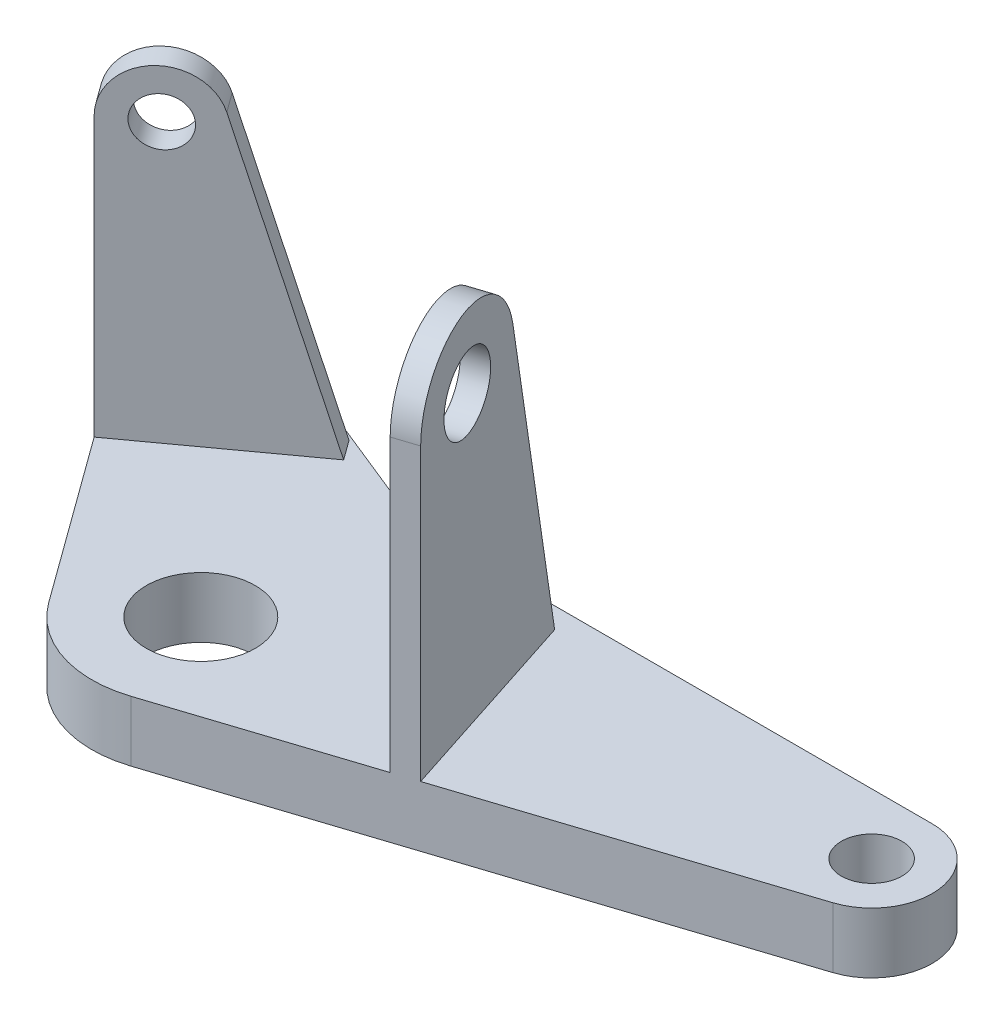
ISO-10303-21;
HEADER;
FILE_DESCRIPTION(('STEP AP214'),'2;1');
FILE_NAME('part.step','',(''),(''),'','','');
FILE_SCHEMA(('AUTOMOTIVE_DESIGN { 1 0 10303 214 1 1 1 1 }'));
ENDSEC;
DATA;
#1=APPLICATION_CONTEXT('core data for automotive mechanical design processes');
#2=APPLICATION_PROTOCOL_DEFINITION('international standard','automotive_design',2000,#1);
#3=PRODUCT_CONTEXT('',#1,'mechanical');
#4=PRODUCT('Part','Part','',(#3));
#5=PRODUCT_RELATED_PRODUCT_CATEGORY('part','',(#4));
#6=PRODUCT_DEFINITION_FORMATION('','',#4);
#7=PRODUCT_DEFINITION_CONTEXT('part definition',#1,'design');
#8=PRODUCT_DEFINITION('design','',#6,#7);
#9=PRODUCT_DEFINITION_SHAPE('','',#8);
#10=(LENGTH_UNIT() NAMED_UNIT(*) SI_UNIT(.MILLI.,.METRE.));
#11=(NAMED_UNIT(*) PLANE_ANGLE_UNIT() SI_UNIT($,.RADIAN.));
#12=(NAMED_UNIT(*) SI_UNIT($,.STERADIAN.) SOLID_ANGLE_UNIT());
#13=UNCERTAINTY_MEASURE_WITH_UNIT(LENGTH_MEASURE(1.E-05),#10,'distance_accuracy_value','');
#14=(GEOMETRIC_REPRESENTATION_CONTEXT(3) GLOBAL_UNCERTAINTY_ASSIGNED_CONTEXT((#13)) GLOBAL_UNIT_ASSIGNED_CONTEXT((#10,
#11,#12)) REPRESENTATION_CONTEXT('',''));
#15=CARTESIAN_POINT('',(0.,0.,0.));
#16=DIRECTION('',(0.,0.,1.));
#17=DIRECTION('',(1.,0.,0.));
#18=AXIS2_PLACEMENT_3D('',#15,#16,#17);
#19=CARTESIAN_POINT('',(-48.,10.,-45.6507127821668));
#20=DIRECTION('',(0.,1.,0.));
#21=DIRECTION('',(0.,0.,1.));
#22=AXIS2_PLACEMENT_3D('',#19,#20,#21);
#23=PLANE('',#22);
#24=DIRECTION('',(-0.809016994374944,8.30017047649198E-13,0.587785252292478));
#25=VECTOR('',#24,1.);
#26=CARTESIAN_POINT('',(-13.0218832017287,9.9999999999755,-37.5096312042176));
#27=LINE('',#26,#25);
#28=CARTESIAN_POINT('',(-13.0218832017374,10.,-37.5096312042176));
#29=VERTEX_POINT('',#28);
#30=CARTESIAN_POINT('',(-36.8981454858631,10.,-20.1625112449833));
#31=VERTEX_POINT('',#30);
#32=EDGE_CURVE('E66',#29,#31,#27,.T.);
#33=ORIENTED_EDGE('',*,*,#32,.F.);
#34=DIRECTION('',(0.587785252292478,0.,0.809016994374944));
#35=VECTOR('',#34,1.);
#36=CARTESIAN_POINT('',(-13.0218832017287,9.9999999999755,-37.5096312042176));
#37=LINE('',#36,#35);
#38=CARTESIAN_POINT('',(-10.6707421925645,10.,-34.2735632267137));
#39=VERTEX_POINT('',#38);
#40=EDGE_CURVE('E61',#29,#39,#37,.T.);
#41=ORIENTED_EDGE('',*,*,#40,.T.);
#42=DIRECTION('',(-0.809016994374944,8.30017047649198E-13,0.587785252292478));
#43=VECTOR('',#42,1.);
#44=CARTESIAN_POINT('',(-10.6707421925588,9.9999999999755,-34.2735632267178));
#45=LINE('',#44,#43);
#46=CARTESIAN_POINT('',(-34.5470044766932,10.,-16.9264432674835));
#47=VERTEX_POINT('',#46);
#48=EDGE_CURVE('E189',#39,#47,#45,.T.);
#49=ORIENTED_EDGE('',*,*,#48,.T.);
#50=DIRECTION('',(0.587785252292477,0.,0.809016994374944));
#51=VECTOR('',#50,1.);
#52=CARTESIAN_POINT('',(-52.8541019662497,10.,-42.1240012684119));
#53=LINE('',#52,#51);
#54=CARTESIAN_POINT('',(-14.562305898749,10.,10.5801345412646));
#55=VERTEX_POINT('',#54);
#56=EDGE_CURVE('E282',#47,#55,#53,.T.);
#57=ORIENTED_EDGE('',*,*,#56,.T.);
#58=CARTESIAN_POINT('',(0.,10.,0.));
#59=DIRECTION('',(0.,1.,0.));
#60=DIRECTION('',(0.,0.,-1.));
#61=AXIS2_PLACEMENT_3D('',#58,#59,#60);
#62=CIRCLE('',#61,18.);
#63=CARTESIAN_POINT('',(5.56230589874895,10.,17.1190172933128));
#64=VERTEX_POINT('',#63);
#65=EDGE_CURVE('E287',#55,#64,#62,.T.);
#66=ORIENTED_EDGE('',*,*,#65,.T.);
#67=DIRECTION('',(0.951056516295155,0.,-0.309016994374942));
#68=VECTOR('',#67,1.);
#69=CARTESIAN_POINT('',(5.56230589874895,10.,17.1190172933128));
#70=LINE('',#69,#68);
#71=CARTESIAN_POINT('',(37.8982274527843,10.,6.61243948456478));
#72=VERTEX_POINT('',#71);
#73=EDGE_CURVE('E291',#64,#72,#70,.T.);
#74=ORIENTED_EDGE('',*,*,#73,.T.);
#75=DIRECTION('',(0.309016994374942,0.,0.951056516295156));
#76=VECTOR('',#75,1.);
#77=CARTESIAN_POINT('',(27.2461637945997,10.,-26.1712414731734));
#78=LINE('',#77,#76);
#79=CARTESIAN_POINT('',(27.2461637945997,10.,-26.1712414731734));
#80=VERTEX_POINT('',#79);
#81=EDGE_CURVE('E209',#80,#72,#78,.T.);
#82=ORIENTED_EDGE('',*,*,#81,.F.);
#83=DIRECTION('',(-0.951056516295155,0.,0.309016994374942));
#84=VECTOR('',#83,1.);
#85=CARTESIAN_POINT('',(31.0503898597803,10.,-27.4073094506732));
#86=LINE('',#85,#84);
#87=CARTESIAN_POINT('',(31.0503898597803,10.,-27.4073094506732));
#88=VERTEX_POINT('',#87);
#89=EDGE_CURVE('E245',#88,#80,#86,.T.);
#90=ORIENTED_EDGE('',*,*,#89,.F.);
#91=DIRECTION('',(0.309016994374942,0.,0.951056516295156));
#92=VECTOR('',#91,1.);
#93=CARTESIAN_POINT('',(31.0503898597803,10.,-27.4073094506732));
#94=LINE('',#93,#92);
#95=CARTESIAN_POINT('',(41.7024535179649,10.,5.37637150706501));
#96=VERTEX_POINT('',#95);
#97=EDGE_CURVE('E213',#88,#96,#94,.T.);
#98=ORIENTED_EDGE('',*,*,#97,.T.);
#99=CARTESIAN_POINT('',(93.0901699437494,10.,-11.3205097041033));
#100=VERTEX_POINT('',#99);
#101=EDGE_CURVE('E290',#96,#100,#70,.T.);
#102=ORIENTED_EDGE('',*,*,#101,.T.);
#103=CARTESIAN_POINT('',(90.,10.,-20.8310748670548));
#104=DIRECTION('',(0.,1.,0.));
#105=DIRECTION('',(0.,0.,1.));
#106=AXIS2_PLACEMENT_3D('',#103,#104,#105);
#107=CIRCLE('',#106,10.);
#108=CARTESIAN_POINT('',(90.,10.,-30.8310748670549));
#109=VERTEX_POINT('',#108);
#110=EDGE_CURVE('E295',#100,#109,#107,.T.);
#111=ORIENTED_EDGE('',*,*,#110,.T.);
#112=DIRECTION('',(-1.,0.,0.));
#113=VECTOR('',#112,1.);
#114=CARTESIAN_POINT('',(90.,10.,-30.8310748670549));
#115=LINE('',#114,#113);
#116=CARTESIAN_POINT('',(12.8606669351914,10.,-30.8310748670548));
#117=VERTEX_POINT('',#116);
#118=EDGE_CURVE('E298',#109,#117,#115,.T.);
#119=ORIENTED_EDGE('',*,*,#118,.T.);
#120=CARTESIAN_POINT('',(12.8606669351914,10.,-72.8310748670548));
#121=DIRECTION('',(0.,-1.,0.));
#122=DIRECTION('',(0.,0.,-1.));
#123=AXIS2_PLACEMENT_3D('',#120,#121,#122);
#124=CIRCLE('',#123,42.);
#125=CARTESIAN_POINT('',(-2.87280998827696,10.,-33.8893529752498));
#126=VERTEX_POINT('',#125);
#127=EDGE_CURVE('E301',#117,#126,#124,.T.);
#128=ORIENTED_EDGE('',*,*,#127,.T.);
#129=DIRECTION('',(-0.927183854566787,0.,-0.374606593415913));
#130=VECTOR('',#129,1.);
#131=CARTESIAN_POINT('',(-2.87280998827696,10.,-33.8893529752498));
#132=LINE('',#131,#130);
#133=CARTESIAN_POINT('',(-45.7523604395045,10.,-51.2138159095675));
#134=VERTEX_POINT('',#133);
#135=EDGE_CURVE('E304',#126,#134,#132,.T.);
#136=ORIENTED_EDGE('',*,*,#135,.T.);
#137=CARTESIAN_POINT('',(-48.,10.,-45.6507127821668));
#138=DIRECTION('',(0.,1.,0.));
#139=DIRECTION('',(0.,0.,1.));
#140=AXIS2_PLACEMENT_3D('',#137,#138,#139);
#141=CIRCLE('',#140,5.99999999999999);
#142=CARTESIAN_POINT('',(-52.8541019662497,10.,-42.1240012684119));
#143=VERTEX_POINT('',#142);
#144=EDGE_CURVE('E278',#134,#143,#141,.T.);
#145=ORIENTED_EDGE('',*,*,#144,.T.);
#146=EDGE_CURVE('E284',#143,#31,#53,.T.);
#147=ORIENTED_EDGE('',*,*,#146,.T.);
#148=EDGE_LOOP('',(#33,#41,#49,#57,#66,#74,#82,#90,#98,#102,#111,#119,#128,#136,#145,#147));
#149=FACE_BOUND('',#148,.T.);
#150=CARTESIAN_POINT('',(90.,10.,-20.8310748670548));
#151=DIRECTION('',(0.,1.,0.));
#152=DIRECTION('',(0.,0.,1.));
#153=AXIS2_PLACEMENT_3D('',#150,#151,#152);
#154=CIRCLE('',#153,5.);
#155=CARTESIAN_POINT('',(90.,10.,-15.8310748670548));
#156=VERTEX_POINT('',#155);
#157=EDGE_CURVE('E262',#156,#156,#154,.T.);
#158=ORIENTED_EDGE('',*,*,#157,.F.);
#159=EDGE_LOOP('',(#158));
#160=FACE_BOUND('',#159,.T.);
#161=CARTESIAN_POINT('',(0.,10.,0.));
#162=DIRECTION('',(0.,1.,0.));
#163=DIRECTION('',(0.,0.,1.));
#164=AXIS2_PLACEMENT_3D('',#161,#162,#163);
#165=CIRCLE('',#164,9.);
#166=CARTESIAN_POINT('',(0.,10.,9.));
#167=VERTEX_POINT('',#166);
#168=EDGE_CURVE('E270',#167,#167,#165,.T.);
#169=ORIENTED_EDGE('',*,*,#168,.F.);
#170=EDGE_LOOP('',(#169));
#171=FACE_BOUND('',#170,.T.);
#172=CARTESIAN_POINT('',(-48.,10.,-45.6507127821668));
#173=DIRECTION('',(0.,1.,0.));
#174=DIRECTION('',(0.,0.,1.));
#175=AXIS2_PLACEMENT_3D('',#172,#173,#174);
#176=CIRCLE('',#175,3.);
#177=CARTESIAN_POINT('',(-48.,10.,-42.6507127821668));
#178=VERTEX_POINT('',#177);
#179=EDGE_CURVE('E254',#178,#178,#176,.T.);
#180=ORIENTED_EDGE('',*,*,#179,.F.);
#181=EDGE_LOOP('',(#180));
#182=FACE_BOUND('',#181,.T.);
#183=ADVANCED_FACE('F45',(#149,#160,#171,#182),#23,.T.);
#184=CARTESIAN_POINT('',(-48.,0.,-45.6507127821668));
#185=DIRECTION('',(0.,1.,0.));
#186=DIRECTION('',(0.,0.,1.));
#187=AXIS2_PLACEMENT_3D('',#184,#185,#186);
#188=PLANE('',#187);
#189=CARTESIAN_POINT('',(-48.,0.,-45.6507127821668));
#190=DIRECTION('',(0.,1.,0.));
#191=DIRECTION('',(0.,0.,1.));
#192=AXIS2_PLACEMENT_3D('',#189,#190,#191);
#193=CIRCLE('',#192,5.99999999999999);
#194=CARTESIAN_POINT('',(-45.7523604395045,0.,-51.2138159095675));
#195=VERTEX_POINT('',#194);
#196=CARTESIAN_POINT('',(-52.8541019662497,0.,-42.1240012684119));
#197=VERTEX_POINT('',#196);
#198=EDGE_CURVE('E274',#195,#197,#193,.T.);
#199=ORIENTED_EDGE('',*,*,#198,.F.);
#200=DIRECTION('',(-0.927183854566787,0.,-0.374606593415913));
#201=VECTOR('',#200,1.);
#202=CARTESIAN_POINT('',(-2.87280998827696,0.,-33.8893529752498));
#203=LINE('',#202,#201);
#204=CARTESIAN_POINT('',(-2.87280998827696,0.,-33.8893529752498));
#205=VERTEX_POINT('',#204);
#206=EDGE_CURVE('E283',#205,#195,#203,.T.);
#207=ORIENTED_EDGE('',*,*,#206,.F.);
#208=CARTESIAN_POINT('',(12.8606669351914,0.,-72.8310748670548));
#209=DIRECTION('',(0.,-1.,0.));
#210=DIRECTION('',(0.,0.,-1.));
#211=AXIS2_PLACEMENT_3D('',#208,#209,#210);
#212=CIRCLE('',#211,42.);
#213=CARTESIAN_POINT('',(12.8606669351914,0.,-30.8310748670548));
#214=VERTEX_POINT('',#213);
#215=EDGE_CURVE('E326',#214,#205,#212,.T.);
#216=ORIENTED_EDGE('',*,*,#215,.F.);
#217=DIRECTION('',(-1.,0.,0.));
#218=VECTOR('',#217,1.);
#219=CARTESIAN_POINT('',(90.,0.,-30.8310748670549));
#220=LINE('',#219,#218);
#221=CARTESIAN_POINT('',(90.,0.,-30.8310748670549));
#222=VERTEX_POINT('',#221);
#223=EDGE_CURVE('E323',#222,#214,#220,.T.);
#224=ORIENTED_EDGE('',*,*,#223,.F.);
#225=CARTESIAN_POINT('',(90.,0.,-20.8310748670548));
#226=DIRECTION('',(0.,1.,0.));
#227=DIRECTION('',(0.,0.,1.));
#228=AXIS2_PLACEMENT_3D('',#225,#226,#227);
#229=CIRCLE('',#228,10.);
#230=CARTESIAN_POINT('',(93.0901699437494,0.,-11.3205097041033));
#231=VERTEX_POINT('',#230);
#232=EDGE_CURVE('E320',#231,#222,#229,.T.);
#233=ORIENTED_EDGE('',*,*,#232,.F.);
#234=DIRECTION('',(0.951056516295155,0.,-0.309016994374942));
#235=VECTOR('',#234,1.);
#236=CARTESIAN_POINT('',(5.56230589874895,0.,17.1190172933128));
#237=LINE('',#236,#235);
#238=CARTESIAN_POINT('',(5.56230589874895,0.,17.1190172933128));
#239=VERTEX_POINT('',#238);
#240=EDGE_CURVE('E317',#239,#231,#237,.T.);
#241=ORIENTED_EDGE('',*,*,#240,.F.);
#242=CARTESIAN_POINT('',(0.,0.,0.));
#243=DIRECTION('',(0.,1.,0.));
#244=DIRECTION('',(0.,0.,-1.));
#245=AXIS2_PLACEMENT_3D('',#242,#243,#244);
#246=CIRCLE('',#245,18.);
#247=CARTESIAN_POINT('',(-14.562305898749,0.,10.5801345412646));
#248=VERTEX_POINT('',#247);
#249=EDGE_CURVE('E314',#248,#239,#246,.T.);
#250=ORIENTED_EDGE('',*,*,#249,.F.);
#251=DIRECTION('',(0.587785252292477,0.,0.809016994374944));
#252=VECTOR('',#251,1.);
#253=CARTESIAN_POINT('',(-52.8541019662497,0.,-42.1240012684119));
#254=LINE('',#253,#252);
#255=EDGE_CURVE('E311',#197,#248,#254,.T.);
#256=ORIENTED_EDGE('',*,*,#255,.F.);
#257=EDGE_LOOP('',(#199,#207,#216,#224,#233,#241,#250,#256));
#258=FACE_BOUND('',#257,.T.);
#259=CARTESIAN_POINT('',(0.,0.,0.));
#260=DIRECTION('',(0.,1.,0.));
#261=DIRECTION('',(0.,0.,1.));
#262=AXIS2_PLACEMENT_3D('',#259,#260,#261);
#263=CIRCLE('',#262,9.);
#264=CARTESIAN_POINT('',(0.,0.,9.));
#265=VERTEX_POINT('',#264);
#266=EDGE_CURVE('E266',#265,#265,#263,.T.);
#267=ORIENTED_EDGE('',*,*,#266,.T.);
#268=EDGE_LOOP('',(#267));
#269=FACE_BOUND('',#268,.T.);
#270=CARTESIAN_POINT('',(90.,0.,-20.8310748670548));
#271=DIRECTION('',(0.,1.,0.));
#272=DIRECTION('',(0.,0.,1.));
#273=AXIS2_PLACEMENT_3D('',#270,#271,#272);
#274=CIRCLE('',#273,5.);
#275=CARTESIAN_POINT('',(90.,0.,-15.8310748670548));
#276=VERTEX_POINT('',#275);
#277=EDGE_CURVE('E258',#276,#276,#274,.T.);
#278=ORIENTED_EDGE('',*,*,#277,.T.);
#279=EDGE_LOOP('',(#278));
#280=FACE_BOUND('',#279,.T.);
#281=CARTESIAN_POINT('',(-48.,0.,-45.6507127821668));
#282=DIRECTION('',(0.,1.,0.));
#283=DIRECTION('',(0.,0.,1.));
#284=AXIS2_PLACEMENT_3D('',#281,#282,#283);
#285=CIRCLE('',#284,3.);
#286=CARTESIAN_POINT('',(-48.,0.,-42.6507127821668));
#287=VERTEX_POINT('',#286);
#288=EDGE_CURVE('E248',#287,#287,#285,.T.);
#289=ORIENTED_EDGE('',*,*,#288,.T.);
#290=EDGE_LOOP('',(#289));
#291=FACE_BOUND('',#290,.T.);
#292=ADVANCED_FACE('F364',(#258,#269,#280,#291),#188,.F.);
#293=CARTESIAN_POINT('',(-48.,10.,-45.6507127821668));
#294=DIRECTION('',(0.,-1.,0.));
#295=DIRECTION('',(0.,0.,-1.));
#296=AXIS2_PLACEMENT_3D('',#293,#294,#295);
#297=CYLINDRICAL_SURFACE('',#296,5.99999999999999);
#298=ORIENTED_EDGE('',*,*,#198,.T.);
#299=DIRECTION('',(0.,-1.,0.));
#300=VECTOR('',#299,1.);
#301=CARTESIAN_POINT('',(-52.8541019662497,10.,-42.1240012684119));
#302=LINE('',#301,#300);
#303=EDGE_CURVE('E11',#143,#197,#302,.T.);
#304=ORIENTED_EDGE('',*,*,#303,.F.);
#305=ORIENTED_EDGE('',*,*,#144,.F.);
#306=DIRECTION('',(0.,-1.,0.));
#307=VECTOR('',#306,1.);
#308=CARTESIAN_POINT('',(-45.7523604395045,10.,-51.2138159095675));
#309=LINE('',#308,#307);
#310=EDGE_CURVE('E307',#134,#195,#309,.T.);
#311=ORIENTED_EDGE('',*,*,#310,.T.);
#312=EDGE_LOOP('',(#298,#304,#305,#311));
#313=FACE_BOUND('',#312,.T.);
#314=ADVANCED_FACE('F47',(#313),#297,.T.);
#315=CARTESIAN_POINT('',(-52.8541019662497,10.,-42.1240012684119));
#316=DIRECTION('',(0.809016994374944,0.,-0.587785252292478));
#317=DIRECTION('',(-0.587785252292478,0.,-0.809016994374944));
#318=AXIS2_PLACEMENT_3D('',#315,#316,#317);
#319=PLANE('',#318);
#320=ORIENTED_EDGE('',*,*,#255,.T.);
#321=DIRECTION('',(0.,-1.,0.));
#322=VECTOR('',#321,1.);
#323=CARTESIAN_POINT('',(-14.562305898749,10.,10.5801345412646));
#324=LINE('',#323,#322);
#325=EDGE_CURVE('E54',#55,#248,#324,.T.);
#326=ORIENTED_EDGE('',*,*,#325,.F.);
#327=ORIENTED_EDGE('',*,*,#56,.F.);
#328=DIRECTION('',(0.,1.,0.));
#329=VECTOR('',#328,1.);
#330=CARTESIAN_POINT('',(-34.5470044766932,10.,-16.9264432674835));
#331=LINE('',#330,#329);
#332=CARTESIAN_POINT('',(-34.5470044766932,56.,-16.9264432674835));
#333=VERTEX_POINT('',#332);
#334=EDGE_CURVE('E172',#47,#333,#331,.T.);
#335=ORIENTED_EDGE('',*,*,#334,.T.);
#336=DIRECTION('',(0.587785252292478,0.,0.809016994374944));
#337=VECTOR('',#336,1.);
#338=CARTESIAN_POINT('',(-36.8981454858631,56.,-20.1625112449833));
#339=LINE('',#338,#337);
#340=CARTESIAN_POINT('',(-36.8981454858631,56.,-20.1625112449833));
#341=VERTEX_POINT('',#340);
#342=EDGE_CURVE('E169',#341,#333,#339,.T.);
#343=ORIENTED_EDGE('',*,*,#342,.F.);
#344=DIRECTION('',(0.,1.,0.));
#345=VECTOR('',#344,1.);
#346=CARTESIAN_POINT('',(-36.8981454858631,10.,-20.1625112449833));
#347=LINE('',#346,#345);
#348=EDGE_CURVE('E158',#31,#341,#347,.T.);
#349=ORIENTED_EDGE('',*,*,#348,.F.);
#350=ORIENTED_EDGE('',*,*,#146,.F.);
#351=ORIENTED_EDGE('',*,*,#303,.T.);
#352=EDGE_LOOP('',(#320,#326,#327,#335,#343,#349,#350,#351));
#353=FACE_BOUND('',#352,.T.);
#354=ADVANCED_FACE('F170',(#353),#319,.F.);
#355=CARTESIAN_POINT('',(0.,10.,0.));
#356=DIRECTION('',(0.,-1.,0.));
#357=DIRECTION('',(0.,0.,-1.));
#358=AXIS2_PLACEMENT_3D('',#355,#356,#357);
#359=CYLINDRICAL_SURFACE('',#358,18.);
#360=ORIENTED_EDGE('',*,*,#249,.T.);
#361=DIRECTION('',(0.,-1.,0.));
#362=VECTOR('',#361,1.);
#363=CARTESIAN_POINT('',(5.56230589874895,10.,17.1190172933128));
#364=LINE('',#363,#362);
#365=EDGE_CURVE('E350',#64,#239,#364,.T.);
#366=ORIENTED_EDGE('',*,*,#365,.F.);
#367=ORIENTED_EDGE('',*,*,#65,.F.);
#368=ORIENTED_EDGE('',*,*,#325,.T.);
#369=EDGE_LOOP('',(#360,#366,#367,#368));
#370=FACE_BOUND('',#369,.T.);
#371=ADVANCED_FACE('F359',(#370),#359,.T.);
#372=CARTESIAN_POINT('',(5.56230589874895,10.,17.1190172933128));
#373=DIRECTION('',(-0.309016994374942,0.,-0.951056516295156));
#374=DIRECTION('',(-0.951056516295156,0.,0.309016994374942));
#375=AXIS2_PLACEMENT_3D('',#372,#373,#374);
#376=PLANE('',#375);
#377=ORIENTED_EDGE('',*,*,#240,.T.);
#378=DIRECTION('',(0.,-1.,0.));
#379=VECTOR('',#378,1.);
#380=CARTESIAN_POINT('',(93.0901699437494,10.,-11.3205097041033));
#381=LINE('',#380,#379);
#382=EDGE_CURVE('E346',#100,#231,#381,.T.);
#383=ORIENTED_EDGE('',*,*,#382,.F.);
#384=ORIENTED_EDGE('',*,*,#101,.F.);
#385=DIRECTION('',(0.,1.,0.));
#386=VECTOR('',#385,1.);
#387=CARTESIAN_POINT('',(41.7024535179649,10.,5.37637150706501));
#388=LINE('',#387,#386);
#389=CARTESIAN_POINT('',(41.7024535179649,58.,5.376371507065));
#390=VERTEX_POINT('',#389);
#391=EDGE_CURVE('E217',#96,#390,#388,.T.);
#392=ORIENTED_EDGE('',*,*,#391,.T.);
#393=DIRECTION('',(-0.951056516295155,0.,0.309016994374942));
#394=VECTOR('',#393,1.);
#395=CARTESIAN_POINT('',(41.7024535179649,58.,5.376371507065));
#396=LINE('',#395,#394);
#397=CARTESIAN_POINT('',(37.8982274527842,58.,6.61243948456477));
#398=VERTEX_POINT('',#397);
#399=EDGE_CURVE('E230',#390,#398,#396,.T.);
#400=ORIENTED_EDGE('',*,*,#399,.T.);
#401=DIRECTION('',(0.,1.,0.));
#402=VECTOR('',#401,1.);
#403=CARTESIAN_POINT('',(37.8982274527843,10.,6.61243948456478));
#404=LINE('',#403,#402);
#405=EDGE_CURVE('E234',#72,#398,#404,.T.);
#406=ORIENTED_EDGE('',*,*,#405,.F.);
#407=ORIENTED_EDGE('',*,*,#73,.F.);
#408=ORIENTED_EDGE('',*,*,#365,.T.);
#409=EDGE_LOOP('',(#377,#383,#384,#392,#400,#406,#407,#408));
#410=FACE_BOUND('',#409,.T.);
#411=ADVANCED_FACE('F370',(#410),#376,.F.);
#412=CARTESIAN_POINT('',(90.,10.,-20.8310748670548));
#413=DIRECTION('',(0.,-1.,0.));
#414=DIRECTION('',(0.,0.,-1.));
#415=AXIS2_PLACEMENT_3D('',#412,#413,#414);
#416=CYLINDRICAL_SURFACE('',#415,10.);
#417=ORIENTED_EDGE('',*,*,#232,.T.);
#418=DIRECTION('',(0.,-1.,0.));
#419=VECTOR('',#418,1.);
#420=CARTESIAN_POINT('',(90.,10.,-30.8310748670549));
#421=LINE('',#420,#419);
#422=EDGE_CURVE('E342',#109,#222,#421,.T.);
#423=ORIENTED_EDGE('',*,*,#422,.F.);
#424=ORIENTED_EDGE('',*,*,#110,.F.);
#425=ORIENTED_EDGE('',*,*,#382,.T.);
#426=EDGE_LOOP('',(#417,#423,#424,#425));
#427=FACE_BOUND('',#426,.T.);
#428=ADVANCED_FACE('F375',(#427),#416,.T.);
#429=CARTESIAN_POINT('',(90.,10.,-30.8310748670549));
#430=DIRECTION('',(0.,0.,1.));
#431=DIRECTION('',(1.,0.,0.));
#432=AXIS2_PLACEMENT_3D('',#429,#430,#431);
#433=PLANE('',#432);
#434=ORIENTED_EDGE('',*,*,#223,.T.);
#435=DIRECTION('',(0.,-1.,0.));
#436=VECTOR('',#435,1.);
#437=CARTESIAN_POINT('',(12.8606669351914,10.,-30.8310748670548));
#438=LINE('',#437,#436);
#439=EDGE_CURVE('E338',#117,#214,#438,.T.);
#440=ORIENTED_EDGE('',*,*,#439,.F.);
#441=ORIENTED_EDGE('',*,*,#118,.F.);
#442=ORIENTED_EDGE('',*,*,#422,.T.);
#443=EDGE_LOOP('',(#434,#440,#441,#442));
#444=FACE_BOUND('',#443,.T.);
#445=ADVANCED_FACE('F420',(#444),#433,.F.);
#446=CARTESIAN_POINT('',(12.8606669351914,10.,-72.8310748670548));
#447=DIRECTION('',(0.,-1.,0.));
#448=DIRECTION('',(0.,0.,-1.));
#449=AXIS2_PLACEMENT_3D('',#446,#447,#448);
#450=CYLINDRICAL_SURFACE('',#449,42.);
#451=ORIENTED_EDGE('',*,*,#215,.T.);
#452=DIRECTION('',(0.,-1.,0.));
#453=VECTOR('',#452,1.);
#454=CARTESIAN_POINT('',(-2.87280998827696,10.,-33.8893529752498));
#455=LINE('',#454,#453);
#456=EDGE_CURVE('E334',#126,#205,#455,.T.);
#457=ORIENTED_EDGE('',*,*,#456,.F.);
#458=ORIENTED_EDGE('',*,*,#127,.F.);
#459=ORIENTED_EDGE('',*,*,#439,.T.);
#460=EDGE_LOOP('',(#451,#457,#458,#459));
#461=FACE_BOUND('',#460,.T.);
#462=ADVANCED_FACE('F416',(#461),#450,.F.);
#463=CARTESIAN_POINT('',(-2.87280998827696,10.,-33.8893529752498));
#464=DIRECTION('',(-0.374606593415913,0.,0.927183854566787));
#465=DIRECTION('',(0.927183854566787,0.,0.374606593415913));
#466=AXIS2_PLACEMENT_3D('',#463,#464,#465);
#467=PLANE('',#466);
#468=ORIENTED_EDGE('',*,*,#206,.T.);
#469=ORIENTED_EDGE('',*,*,#310,.F.);
#470=ORIENTED_EDGE('',*,*,#135,.F.);
#471=ORIENTED_EDGE('',*,*,#456,.T.);
#472=EDGE_LOOP('',(#468,#469,#470,#471));
#473=FACE_BOUND('',#472,.T.);
#474=ADVANCED_FACE('F413',(#473),#467,.F.);
#475=CARTESIAN_POINT('',(0.,10.,0.));
#476=DIRECTION('',(0.,-1.,0.));
#477=DIRECTION('',(0.,0.,-1.));
#478=AXIS2_PLACEMENT_3D('',#475,#476,#477);
#479=CYLINDRICAL_SURFACE('',#478,9.);
#480=ORIENTED_EDGE('',*,*,#168,.T.);
#481=EDGE_LOOP('',(#480));
#482=FACE_BOUND('',#481,.T.);
#483=ORIENTED_EDGE('',*,*,#266,.F.);
#484=EDGE_LOOP('',(#483));
#485=FACE_BOUND('',#484,.T.);
#486=ADVANCED_FACE('F410',(#482,#485),#479,.F.);
#487=CARTESIAN_POINT('',(90.,10.,-20.8310748670548));
#488=DIRECTION('',(0.,-1.,0.));
#489=DIRECTION('',(0.,0.,-1.));
#490=AXIS2_PLACEMENT_3D('',#487,#488,#489);
#491=CYLINDRICAL_SURFACE('',#490,5.);
#492=ORIENTED_EDGE('',*,*,#157,.T.);
#493=EDGE_LOOP('',(#492));
#494=FACE_BOUND('',#493,.T.);
#495=ORIENTED_EDGE('',*,*,#277,.F.);
#496=EDGE_LOOP('',(#495));
#497=FACE_BOUND('',#496,.T.);
#498=ADVANCED_FACE('F481',(#494,#497),#491,.F.);
#499=CARTESIAN_POINT('',(-48.,10.,-45.6507127821668));
#500=DIRECTION('',(0.,-1.,0.));
#501=DIRECTION('',(0.,0.,-1.));
#502=AXIS2_PLACEMENT_3D('',#499,#500,#501);
#503=CYLINDRICAL_SURFACE('',#502,3.);
#504=ORIENTED_EDGE('',*,*,#179,.T.);
#505=EDGE_LOOP('',(#504));
#506=FACE_BOUND('',#505,.T.);
#507=ORIENTED_EDGE('',*,*,#288,.F.);
#508=EDGE_LOOP('',(#507));
#509=FACE_BOUND('',#508,.T.);
#510=ADVANCED_FACE('F489',(#506,#509),#503,.F.);
#511=CARTESIAN_POINT('',(34.3670788058597,60.494940289813,-17.1995904833932));
#512=DIRECTION('',(-0.302264231633822,0.207911690817752,-0.930273649576359));
#513=DIRECTION('',(-0.951056516295155,0.,0.309016994374942));
#514=AXIS2_PLACEMENT_3D('',#511,#512,#513);
#515=PLANE('',#514);
#516=DIRECTION('',(-0.064248245791914,-0.978147600733807,-0.197735768366167));
#517=VECTOR('',#516,1.);
#518=CARTESIAN_POINT('',(30.5628527406791,60.494940289813,-15.9635225058934));
#519=LINE('',#518,#517);
#520=CARTESIAN_POINT('',(30.5628527406791,60.494940289813,-15.9635225058934));
#521=VERTEX_POINT('',#520);
#522=EDGE_CURVE('E218',#521,#80,#519,.T.);
#523=ORIENTED_EDGE('',*,*,#522,.F.);
#524=DIRECTION('',(-0.951056516295155,0.,0.309016994374942));
#525=VECTOR('',#524,1.);
#526=CARTESIAN_POINT('',(34.3670788058597,60.494940289813,-17.1995904833932));
#527=LINE('',#526,#525);
#528=CARTESIAN_POINT('',(34.3670788058597,60.494940289813,-17.1995904833932));
#529=VERTEX_POINT('',#528);
#530=EDGE_CURVE('E249',#529,#521,#527,.T.);
#531=ORIENTED_EDGE('',*,*,#530,.F.);
#532=DIRECTION('',(-0.064248245791914,-0.978147600733807,-0.197735768366167));
#533=VECTOR('',#532,1.);
#534=CARTESIAN_POINT('',(34.3670788058597,60.494940289813,-17.1995904833932));
#535=LINE('',#534,#533);
#536=EDGE_CURVE('E226',#529,#88,#535,.T.);
#537=ORIENTED_EDGE('',*,*,#536,.T.);
#538=ORIENTED_EDGE('',*,*,#89,.T.);
#539=EDGE_LOOP('',(#523,#531,#537,#538));
#540=FACE_BOUND('',#539,.T.);
#541=ADVANCED_FACE('F496',(#540),#515,.T.);
#542=CARTESIAN_POINT('',(37.9942495854656,58.,-6.03630668847686));
#543=DIRECTION('',(-0.951056516295155,0.,0.309016994374942));
#544=DIRECTION('',(0.309016994374942,0.,0.951056516295156));
#545=AXIS2_PLACEMENT_3D('',#542,#543,#544);
#546=CYLINDRICAL_SURFACE('',#545,12.);
#547=CARTESIAN_POINT('',(34.1900235202849,58.,-4.8002387109771));
#548=DIRECTION('',(-0.951056516295156,0.,0.309016994374942));
#549=DIRECTION('',(0.309016994374942,0.,0.951056516295156));
#550=AXIS2_PLACEMENT_3D('',#547,#548,#549);
#551=CIRCLE('',#550,12.);
#552=EDGE_CURVE('E238',#398,#521,#551,.T.);
#553=ORIENTED_EDGE('',*,*,#552,.F.);
#554=ORIENTED_EDGE('',*,*,#399,.F.);
#555=CARTESIAN_POINT('',(37.9942495854656,58.,-6.03630668847686));
#556=DIRECTION('',(-0.951056516295156,0.,0.309016994374942));
#557=DIRECTION('',(0.309016994374942,0.,0.951056516295156));
#558=AXIS2_PLACEMENT_3D('',#555,#556,#557);
#559=CIRCLE('',#558,12.);
#560=EDGE_CURVE('E222',#390,#529,#559,.T.);
#561=ORIENTED_EDGE('',*,*,#560,.T.);
#562=ORIENTED_EDGE('',*,*,#530,.T.);
#563=EDGE_LOOP('',(#553,#554,#561,#562));
#564=FACE_BOUND('',#563,.T.);
#565=ADVANCED_FACE('F510',(#564),#546,.T.);
#566=CARTESIAN_POINT('',(37.9942495854656,58.,-6.03630668847686));
#567=DIRECTION('',(-0.951056516295156,0.,0.309016994374942));
#568=DIRECTION('',(0.309016994374942,0.,0.951056516295156));
#569=AXIS2_PLACEMENT_3D('',#566,#567,#568);
#570=PLANE('',#569);
#571=CARTESIAN_POINT('',(37.9942495854656,58.,-6.03630668847686));
#572=DIRECTION('',(-0.951056516295156,0.,0.309016994374942));
#573=DIRECTION('',(0.309016994374942,0.,0.951056516295156));
#574=AXIS2_PLACEMENT_3D('',#571,#572,#573);
#575=CIRCLE('',#574,6.);
#576=CARTESIAN_POINT('',(39.8483515517152,58.,-0.329967590705933));
#577=VERTEX_POINT('',#576);
#578=EDGE_CURVE('E205',#577,#577,#575,.T.);
#579=ORIENTED_EDGE('',*,*,#578,.T.);
#580=EDGE_LOOP('',(#579));
#581=FACE_BOUND('',#580,.T.);
#582=ORIENTED_EDGE('',*,*,#97,.F.);
#583=ORIENTED_EDGE('',*,*,#536,.F.);
#584=ORIENTED_EDGE('',*,*,#560,.F.);
#585=ORIENTED_EDGE('',*,*,#391,.F.);
#586=EDGE_LOOP('',(#582,#583,#584,#585));
#587=FACE_BOUND('',#586,.T.);
#588=ADVANCED_FACE('F519',(#581,#587),#570,.F.);
#589=CARTESIAN_POINT('',(34.1900235202849,58.,-4.8002387109771));
#590=DIRECTION('',(-0.951056516295156,0.,0.309016994374942));
#591=DIRECTION('',(0.309016994374942,0.,0.951056516295156));
#592=AXIS2_PLACEMENT_3D('',#589,#590,#591);
#593=PLANE('',#592);
#594=CARTESIAN_POINT('',(34.1900235202849,58.,-4.8002387109771));
#595=DIRECTION('',(-0.951056516295156,0.,0.309016994374942));
#596=DIRECTION('',(0.309016994374942,0.,0.951056516295156));
#597=AXIS2_PLACEMENT_3D('',#594,#595,#596);
#598=CIRCLE('',#597,6.);
#599=CARTESIAN_POINT('',(36.0441254865346,58.,0.906100386793834));
#600=VERTEX_POINT('',#599);
#601=EDGE_CURVE('E176',#600,#600,#598,.T.);
#602=ORIENTED_EDGE('',*,*,#601,.F.);
#603=EDGE_LOOP('',(#602));
#604=FACE_BOUND('',#603,.T.);
#605=ORIENTED_EDGE('',*,*,#81,.T.);
#606=ORIENTED_EDGE('',*,*,#405,.T.);
#607=ORIENTED_EDGE('',*,*,#552,.T.);
#608=ORIENTED_EDGE('',*,*,#522,.T.);
#609=EDGE_LOOP('',(#605,#606,#607,#608));
#610=FACE_BOUND('',#609,.T.);
#611=ADVANCED_FACE('F528',(#604,#610),#593,.T.);
#612=CARTESIAN_POINT('',(37.9942495854656,58.,-6.03630668847686));
#613=DIRECTION('',(-0.951056516295155,0.,0.309016994374942));
#614=DIRECTION('',(0.309016994374942,0.,0.951056516295156));
#615=AXIS2_PLACEMENT_3D('',#612,#613,#614);
#616=CYLINDRICAL_SURFACE('',#615,6.);
#617=ORIENTED_EDGE('',*,*,#578,.F.);
#618=EDGE_LOOP('',(#617));
#619=FACE_BOUND('',#618,.T.);
#620=ORIENTED_EDGE('',*,*,#601,.T.);
#621=EDGE_LOOP('',(#620));
#622=FACE_BOUND('',#621,.T.);
#623=ADVANCED_FACE('F536',(#619,#622),#616,.F.);
#624=CARTESIAN_POINT('',(-30.4260095308636,56.,-24.8647932633231));
#625=DIRECTION('',(-0.587785252292478,0.,-0.809016994374944));
#626=DIRECTION('',(-0.809016994374944,0.,0.587785252292478));
#627=AXIS2_PLACEMENT_3D('',#624,#625,#626);
#628=PLANE('',#627);
#629=ORIENTED_EDGE('',*,*,#32,.T.);
#630=ORIENTED_EDGE('',*,*,#348,.T.);
#631=CARTESIAN_POINT('',(-30.4260095308636,56.,-24.8647932633231));
#632=DIRECTION('',(-0.587785252292478,0.,-0.809016994374944));
#633=DIRECTION('',(-0.809016994374944,0.,0.587785252292478));
#634=AXIS2_PLACEMENT_3D('',#631,#632,#633);
#635=CIRCLE('',#634,8.);
#636=CARTESIAN_POINT('',(-24.2045931464173,58.2050988465359,-29.3849168510527));
#637=VERTEX_POINT('',#636);
#638=EDGE_CURVE('E163',#341,#637,#635,.T.);
#639=ORIENTED_EDGE('',*,*,#638,.T.);
#640=DIRECTION('',(0.22299530514052,-0.961261695938321,-0.162015572730122));
#641=VECTOR('',#640,1.);
#642=CARTESIAN_POINT('',(-24.2045931464173,58.2050988465359,-29.3849168510527));
#643=LINE('',#642,#641);
#644=EDGE_CURVE('E183',#637,#29,#643,.T.);
#645=ORIENTED_EDGE('',*,*,#644,.T.);
#646=EDGE_LOOP('',(#629,#630,#639,#645));
#647=FACE_BOUND('',#646,.T.);
#648=CARTESIAN_POINT('',(-30.4260095308636,56.,-24.8647932633231));
#649=DIRECTION('',(-0.587785252292478,0.,-0.809016994374944));
#650=DIRECTION('',(-0.809016994374944,0.,0.587785252292478));
#651=AXIS2_PLACEMENT_3D('',#648,#649,#650);
#652=CIRCLE('',#651,4.00000000000001);
#653=CARTESIAN_POINT('',(-33.6620775083634,56.,-22.5136522541532));
#654=VERTEX_POINT('',#653);
#655=EDGE_CURVE('E192',#654,#654,#652,.T.);
#656=ORIENTED_EDGE('',*,*,#655,.F.);
#657=EDGE_LOOP('',(#656));
#658=FACE_BOUND('',#657,.T.);
#659=ADVANCED_FACE('F160',(#647,#658),#628,.T.);
#660=CARTESIAN_POINT('',(-28.0748685216937,56.,-21.6287252858233));
#661=DIRECTION('',(-0.587785252292478,0.,-0.809016994374944));
#662=DIRECTION('',(-0.809016994374944,0.,0.587785252292478));
#663=AXIS2_PLACEMENT_3D('',#660,#661,#662);
#664=PLANE('',#663);
#665=ORIENTED_EDGE('',*,*,#48,.F.);
#666=DIRECTION('',(0.22299530514052,-0.961261695938321,-0.162015572730122));
#667=VECTOR('',#666,1.);
#668=CARTESIAN_POINT('',(-21.8534521372474,58.2050988465359,-26.1488488735529));
#669=LINE('',#668,#667);
#670=CARTESIAN_POINT('',(-21.8534521372474,58.2050988465359,-26.1488488735529));
#671=VERTEX_POINT('',#670);
#672=EDGE_CURVE('E198',#671,#39,#669,.T.);
#673=ORIENTED_EDGE('',*,*,#672,.F.);
#674=CARTESIAN_POINT('',(-28.0748685216937,56.,-21.6287252858233));
#675=DIRECTION('',(-0.587785252292478,0.,-0.809016994374944));
#676=DIRECTION('',(-0.809016994374944,0.,0.587785252292478));
#677=AXIS2_PLACEMENT_3D('',#674,#675,#676);
#678=CIRCLE('',#677,8.);
#679=EDGE_CURVE('E195',#333,#671,#678,.T.);
#680=ORIENTED_EDGE('',*,*,#679,.F.);
#681=ORIENTED_EDGE('',*,*,#334,.F.);
#682=EDGE_LOOP('',(#665,#673,#680,#681));
#683=FACE_BOUND('',#682,.T.);
#684=CARTESIAN_POINT('',(-28.0748685216937,56.,-21.6287252858233));
#685=DIRECTION('',(-0.587785252292478,0.,-0.809016994374944));
#686=DIRECTION('',(-0.809016994374944,0.,0.587785252292478));
#687=AXIS2_PLACEMENT_3D('',#684,#685,#686);
#688=CIRCLE('',#687,4.00000000000001);
#689=CARTESIAN_POINT('',(-31.3109364991935,56.,-19.2775842766534));
#690=VERTEX_POINT('',#689);
#691=EDGE_CURVE('E639',#690,#690,#688,.T.);
#692=ORIENTED_EDGE('',*,*,#691,.T.);
#693=EDGE_LOOP('',(#692));
#694=FACE_BOUND('',#693,.T.);
#695=ADVANCED_FACE('F386',(#683,#694),#664,.F.);
#696=CARTESIAN_POINT('',(-30.4260095308636,56.,-24.8647932633231));
#697=DIRECTION('',(0.587785252292478,0.,0.809016994374944));
#698=DIRECTION('',(0.809016994374944,0.,-0.587785252292478));
#699=AXIS2_PLACEMENT_3D('',#696,#697,#698);
#700=CYLINDRICAL_SURFACE('',#699,8.);
#701=ORIENTED_EDGE('',*,*,#679,.T.);
#702=DIRECTION('',(0.587785252292478,0.,0.809016994374944));
#703=VECTOR('',#702,1.);
#704=CARTESIAN_POINT('',(-24.2045931464173,58.2050988465359,-29.3849168510527));
#705=LINE('',#704,#703);
#706=EDGE_CURVE('E177',#637,#671,#705,.T.);
#707=ORIENTED_EDGE('',*,*,#706,.F.);
#708=ORIENTED_EDGE('',*,*,#638,.F.);
#709=ORIENTED_EDGE('',*,*,#342,.T.);
#710=EDGE_LOOP('',(#701,#707,#708,#709));
#711=FACE_BOUND('',#710,.T.);
#712=ADVANCED_FACE('F179',(#711),#700,.T.);
#713=CARTESIAN_POINT('',(-24.2045931464173,58.2050988465359,-29.3849168510527));
#714=DIRECTION('',(-0.777677048055782,-0.275637355816993,0.565015448466201));
#715=DIRECTION('',(0.587785252292478,0.,0.809016994374944));
#716=AXIS2_PLACEMENT_3D('',#713,#714,#715);
#717=PLANE('',#716);
#718=ORIENTED_EDGE('',*,*,#672,.T.);
#719=ORIENTED_EDGE('',*,*,#40,.F.);
#720=ORIENTED_EDGE('',*,*,#644,.F.);
#721=ORIENTED_EDGE('',*,*,#706,.T.);
#722=EDGE_LOOP('',(#718,#719,#720,#721));
#723=FACE_BOUND('',#722,.T.);
#724=ADVANCED_FACE('F389',(#723),#717,.F.);
#725=CARTESIAN_POINT('',(-30.4260095308636,56.,-24.8647932633231));
#726=DIRECTION('',(0.587785252292478,0.,0.809016994374944));
#727=DIRECTION('',(0.809016994374944,0.,-0.587785252292478));
#728=AXIS2_PLACEMENT_3D('',#725,#726,#727);
#729=CYLINDRICAL_SURFACE('',#728,4.00000000000001);
#730=ORIENTED_EDGE('',*,*,#655,.T.);
#731=EDGE_LOOP('',(#730));
#732=FACE_BOUND('',#731,.T.);
#733=ORIENTED_EDGE('',*,*,#691,.F.);
#734=EDGE_LOOP('',(#733));
#735=FACE_BOUND('',#734,.T.);
#736=ADVANCED_FACE('F391',(#732,#735),#729,.F.);
#737=CLOSED_SHELL('',(#183,#292,#314,#354,#371,#411,#428,#445,#462,#474,#486,#498,#510,#541,
#565,#588,#611,#623,#659,#695,#712,#724,#736));
#738=MANIFOLD_SOLID_BREP('B2',#737);
#739=ADVANCED_BREP_SHAPE_REPRESENTATION('',(#18,#738),#14);
#740=SHAPE_DEFINITION_REPRESENTATION(#9,#739);
ENDSEC;
END-ISO-10303-21;
